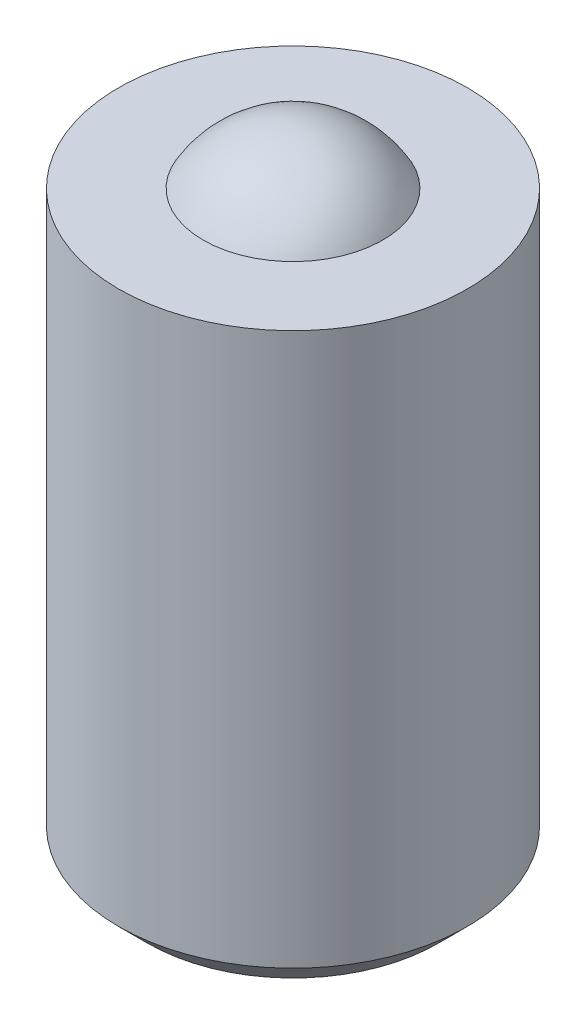
ISO-10303-21;
HEADER;
FILE_DESCRIPTION(('STEP AP214'),'2;1');
FILE_NAME('part.step','',(''),(''),'','','');
FILE_SCHEMA(('AUTOMOTIVE_DESIGN { 1 0 10303 214 1 1 1 1 }'));
ENDSEC;
DATA;
#1=APPLICATION_CONTEXT('core data for automotive mechanical design processes');
#2=APPLICATION_PROTOCOL_DEFINITION('international standard','automotive_design',2000,#1);
#3=PRODUCT_CONTEXT('',#1,'mechanical');
#4=PRODUCT('Part','Part','',(#3));
#5=PRODUCT_RELATED_PRODUCT_CATEGORY('part','',(#4));
#6=PRODUCT_DEFINITION_FORMATION('','',#4);
#7=PRODUCT_DEFINITION_CONTEXT('part definition',#1,'design');
#8=PRODUCT_DEFINITION('design','',#6,#7);
#9=PRODUCT_DEFINITION_SHAPE('','',#8);
#10=(LENGTH_UNIT() NAMED_UNIT(*) SI_UNIT(.MILLI.,.METRE.));
#11=(NAMED_UNIT(*) PLANE_ANGLE_UNIT() SI_UNIT($,.RADIAN.));
#12=(NAMED_UNIT(*) SI_UNIT($,.STERADIAN.) SOLID_ANGLE_UNIT());
#13=UNCERTAINTY_MEASURE_WITH_UNIT(LENGTH_MEASURE(1.E-05),#10,'distance_accuracy_value','');
#14=(GEOMETRIC_REPRESENTATION_CONTEXT(3) GLOBAL_UNCERTAINTY_ASSIGNED_CONTEXT((#13)) GLOBAL_UNIT_ASSIGNED_CONTEXT((#10,
#11,#12)) REPRESENTATION_CONTEXT('',''));
#15=CARTESIAN_POINT('',(0.,0.,0.));
#16=DIRECTION('',(0.,0.,1.));
#17=DIRECTION('',(1.,0.,0.));
#18=AXIS2_PLACEMENT_3D('',#15,#16,#17);
#19=CARTESIAN_POINT('',(0.,-1.75,0.));
#20=DIRECTION('',(0.,1.,0.));
#21=DIRECTION('',(0.,0.,1.));
#22=AXIS2_PLACEMENT_3D('',#19,#20,#21);
#23=SPHERICAL_SURFACE('',#22,3.55);
#24=CARTESIAN_POINT('',(0.,0.,0.));
#25=DIRECTION('',(0.,1.,0.));
#26=DIRECTION('',(0.,0.,1.));
#27=AXIS2_PLACEMENT_3D('',#24,#25,#26);
#28=CIRCLE('',#27,3.08868904229609);
#29=CARTESIAN_POINT('',(0.,0.,3.08868904229609));
#30=VERTEX_POINT('',#29);
#31=EDGE_CURVE('E11',#30,#30,#28,.T.);
#32=ORIENTED_EDGE('',*,*,#31,.T.);
#33=EDGE_LOOP('',(#32));
#34=FACE_BOUND('',#33,.T.);
#35=ADVANCED_FACE('F37',(#34),#23,.T.);
#36=CARTESIAN_POINT('',(0.,0.,3.08868904229609));
#37=DIRECTION('',(0.,1.,0.));
#38=DIRECTION('',(0.,0.,1.));
#39=AXIS2_PLACEMENT_3D('',#36,#37,#38);
#40=PLANE('',#39);
#41=CARTESIAN_POINT('',(0.,0.,0.));
#42=DIRECTION('',(0.,1.,0.));
#43=DIRECTION('',(0.,0.,1.));
#44=AXIS2_PLACEMENT_3D('',#41,#42,#43);
#45=CIRCLE('',#44,5.99999999999999);
#46=CARTESIAN_POINT('',(0.,0.,5.99999999999999));
#47=VERTEX_POINT('',#46);
#48=EDGE_CURVE('E44',#47,#47,#45,.T.);
#49=ORIENTED_EDGE('',*,*,#48,.T.);
#50=EDGE_LOOP('',(#49));
#51=FACE_BOUND('',#50,.T.);
#52=ORIENTED_EDGE('',*,*,#31,.F.);
#53=EDGE_LOOP('',(#52));
#54=FACE_BOUND('',#53,.T.);
#55=ADVANCED_FACE('F151',(#51,#54),#40,.T.);
#56=CARTESIAN_POINT('',(0.,46.2984024863754,0.));
#57=DIRECTION('',(0.,1.,0.));
#58=DIRECTION('',(0.,0.,1.));
#59=AXIS2_PLACEMENT_3D('',#56,#57,#58);
#60=CYLINDRICAL_SURFACE('',#59,5.99999999999999);
#61=CARTESIAN_POINT('',(0.,-19.,0.));
#62=DIRECTION('',(0.,1.,0.));
#63=DIRECTION('',(0.,0.,1.));
#64=AXIS2_PLACEMENT_3D('',#61,#62,#63);
#65=CIRCLE('',#64,5.99999999999999);
#66=CARTESIAN_POINT('',(0.,-19.,5.99999999999999));
#67=VERTEX_POINT('',#66);
#68=EDGE_CURVE('E146',#67,#67,#65,.T.);
#69=ORIENTED_EDGE('',*,*,#68,.T.);
#70=EDGE_LOOP('',(#69));
#71=FACE_BOUND('',#70,.T.);
#72=ORIENTED_EDGE('',*,*,#48,.F.);
#73=EDGE_LOOP('',(#72));
#74=FACE_BOUND('',#73,.T.);
#75=ADVANCED_FACE('F154',(#71,#74),#60,.T.);
#76=CARTESIAN_POINT('',(0.,-19.,0.));
#77=DIRECTION('',(0.,1.,0.));
#78=DIRECTION('',(0.,0.,1.));
#79=AXIS2_PLACEMENT_3D('',#76,#77,#78);
#80=CONICAL_SURFACE('',#79,5.99999999999999,0.785398163397444);
#81=CARTESIAN_POINT('',(0.,-20.,0.));
#82=DIRECTION('',(0.,1.,0.));
#83=DIRECTION('',(0.,0.,1.));
#84=AXIS2_PLACEMENT_3D('',#81,#82,#83);
#85=CIRCLE('',#84,5.);
#86=CARTESIAN_POINT('',(0.,-20.,5.));
#87=VERTEX_POINT('',#86);
#88=EDGE_CURVE('E138',#87,#87,#85,.T.);
#89=ORIENTED_EDGE('',*,*,#88,.T.);
#90=EDGE_LOOP('',(#89));
#91=FACE_BOUND('',#90,.T.);
#92=ORIENTED_EDGE('',*,*,#68,.F.);
#93=EDGE_LOOP('',(#92));
#94=FACE_BOUND('',#93,.T.);
#95=ADVANCED_FACE('F156',(#91,#94),#80,.T.);
#96=CARTESIAN_POINT('',(0.,-20.,5.));
#97=DIRECTION('',(0.,-1.,0.));
#98=DIRECTION('',(0.,0.,-1.));
#99=AXIS2_PLACEMENT_3D('',#96,#97,#98);
#100=PLANE('',#99);
#101=DIRECTION('',(-0.866025403784439,0.,0.5));
#102=VECTOR('',#101,1.);
#103=CARTESIAN_POINT('',(3.,-20.,1.73205080756888));
#104=LINE('',#103,#102);
#105=CARTESIAN_POINT('',(3.,-20.,1.73205080756888));
#106=VERTEX_POINT('',#105);
#107=CARTESIAN_POINT('',(0.,-20.,3.46410161513775));
#108=VERTEX_POINT('',#107);
#109=EDGE_CURVE('E51',#106,#108,#104,.T.);
#110=ORIENTED_EDGE('',*,*,#109,.F.);
#111=DIRECTION('',(0.,0.,1.));
#112=VECTOR('',#111,1.);
#113=CARTESIAN_POINT('',(3.,-20.,-1.73205080756888));
#114=LINE('',#113,#112);
#115=CARTESIAN_POINT('',(3.,-20.,-1.73205080756888));
#116=VERTEX_POINT('',#115);
#117=EDGE_CURVE('E134',#116,#106,#114,.T.);
#118=ORIENTED_EDGE('',*,*,#117,.F.);
#119=DIRECTION('',(0.866025403784439,0.,0.5));
#120=VECTOR('',#119,1.);
#121=CARTESIAN_POINT('',(0.,-20.,-3.46410161513775));
#122=LINE('',#121,#120);
#123=CARTESIAN_POINT('',(0.,-20.,-3.46410161513775));
#124=VERTEX_POINT('',#123);
#125=EDGE_CURVE('E132',#124,#116,#122,.T.);
#126=ORIENTED_EDGE('',*,*,#125,.F.);
#127=DIRECTION('',(0.866025403784439,0.,-0.5));
#128=VECTOR('',#127,1.);
#129=CARTESIAN_POINT('',(-3.,-20.,-1.73205080756888));
#130=LINE('',#129,#128);
#131=CARTESIAN_POINT('',(-3.,-20.,-1.73205080756888));
#132=VERTEX_POINT('',#131);
#133=EDGE_CURVE('E99',#132,#124,#130,.T.);
#134=ORIENTED_EDGE('',*,*,#133,.F.);
#135=DIRECTION('',(0.,0.,-1.));
#136=VECTOR('',#135,1.);
#137=CARTESIAN_POINT('',(-3.,-20.,1.73205080756888));
#138=LINE('',#137,#136);
#139=CARTESIAN_POINT('',(-3.,-20.,1.73205080756888));
#140=VERTEX_POINT('',#139);
#141=EDGE_CURVE('E128',#140,#132,#138,.T.);
#142=ORIENTED_EDGE('',*,*,#141,.F.);
#143=DIRECTION('',(-0.866025403784438,0.,-0.5));
#144=VECTOR('',#143,1.);
#145=CARTESIAN_POINT('',(0.,-20.,3.46410161513775));
#146=LINE('',#145,#144);
#147=EDGE_CURVE('E125',#108,#140,#146,.T.);
#148=ORIENTED_EDGE('',*,*,#147,.F.);
#149=EDGE_LOOP('',(#110,#118,#126,#134,#142,#148));
#150=FACE_BOUND('',#149,.T.);
#151=ORIENTED_EDGE('',*,*,#88,.F.);
#152=EDGE_LOOP('',(#151));
#153=FACE_BOUND('',#152,.T.);
#154=ADVANCED_FACE('F163',(#150,#153),#100,.T.);
#155=CARTESIAN_POINT('',(3.,-17.,1.73205080756888));
#156=DIRECTION('',(0.5,0.,0.866025403784439));
#157=DIRECTION('',(0.866025403784439,0.,-0.5));
#158=AXIS2_PLACEMENT_3D('',#155,#156,#157);
#159=PLANE('',#158);
#160=ORIENTED_EDGE('',*,*,#109,.T.);
#161=DIRECTION('',(0.,-1.,0.));
#162=VECTOR('',#161,1.);
#163=CARTESIAN_POINT('',(0.,-17.,3.46410161513775));
#164=LINE('',#163,#162);
#165=CARTESIAN_POINT('',(0.,-17.,3.46410161513775));
#166=VERTEX_POINT('',#165);
#167=EDGE_CURVE('E81',#166,#108,#164,.T.);
#168=ORIENTED_EDGE('',*,*,#167,.F.);
#169=DIRECTION('',(-0.866025403784439,0.,0.5));
#170=VECTOR('',#169,1.);
#171=CARTESIAN_POINT('',(3.,-17.,1.73205080756888));
#172=LINE('',#171,#170);
#173=CARTESIAN_POINT('',(3.,-17.,1.73205080756888));
#174=VERTEX_POINT('',#173);
#175=EDGE_CURVE('E136',#174,#166,#172,.T.);
#176=ORIENTED_EDGE('',*,*,#175,.F.);
#177=DIRECTION('',(0.,-1.,0.));
#178=VECTOR('',#177,1.);
#179=CARTESIAN_POINT('',(3.,-17.,1.73205080756888));
#180=LINE('',#179,#178);
#181=EDGE_CURVE('E59',#174,#106,#180,.T.);
#182=ORIENTED_EDGE('',*,*,#181,.T.);
#183=EDGE_LOOP('',(#160,#168,#176,#182));
#184=FACE_BOUND('',#183,.T.);
#185=ADVANCED_FACE('F194',(#184),#159,.F.);
#186=CARTESIAN_POINT('',(3.,-17.,-1.73205080756888));
#187=DIRECTION('',(1.,0.,0.));
#188=DIRECTION('',(0.,0.,-1.));
#189=AXIS2_PLACEMENT_3D('',#186,#187,#188);
#190=PLANE('',#189);
#191=ORIENTED_EDGE('',*,*,#117,.T.);
#192=ORIENTED_EDGE('',*,*,#181,.F.);
#193=DIRECTION('',(0.,0.,1.));
#194=VECTOR('',#193,1.);
#195=CARTESIAN_POINT('',(3.,-17.,-1.73205080756888));
#196=LINE('',#195,#194);
#197=CARTESIAN_POINT('',(3.,-17.,-1.73205080756888));
#198=VERTEX_POINT('',#197);
#199=EDGE_CURVE('E111',#198,#174,#196,.T.);
#200=ORIENTED_EDGE('',*,*,#199,.F.);
#201=DIRECTION('',(0.,-1.,0.));
#202=VECTOR('',#201,1.);
#203=CARTESIAN_POINT('',(3.,-17.,-1.73205080756888));
#204=LINE('',#203,#202);
#205=EDGE_CURVE('E103',#198,#116,#204,.T.);
#206=ORIENTED_EDGE('',*,*,#205,.T.);
#207=EDGE_LOOP('',(#191,#192,#200,#206));
#208=FACE_BOUND('',#207,.T.);
#209=ADVANCED_FACE('F204',(#208),#190,.F.);
#210=CARTESIAN_POINT('',(0.,-17.,-3.46410161513775));
#211=DIRECTION('',(0.5,0.,-0.866025403784438));
#212=DIRECTION('',(-0.866025403784439,0.,-0.5));
#213=AXIS2_PLACEMENT_3D('',#210,#211,#212);
#214=PLANE('',#213);
#215=ORIENTED_EDGE('',*,*,#125,.T.);
#216=ORIENTED_EDGE('',*,*,#205,.F.);
#217=DIRECTION('',(0.866025403784439,0.,0.5));
#218=VECTOR('',#217,1.);
#219=CARTESIAN_POINT('',(0.,-17.,-3.46410161513775));
#220=LINE('',#219,#218);
#221=CARTESIAN_POINT('',(0.,-17.,-3.46410161513775));
#222=VERTEX_POINT('',#221);
#223=EDGE_CURVE('E107',#222,#198,#220,.T.);
#224=ORIENTED_EDGE('',*,*,#223,.F.);
#225=DIRECTION('',(0.,-1.,0.));
#226=VECTOR('',#225,1.);
#227=CARTESIAN_POINT('',(0.,-17.,-3.46410161513775));
#228=LINE('',#227,#226);
#229=EDGE_CURVE('E92',#222,#124,#228,.T.);
#230=ORIENTED_EDGE('',*,*,#229,.T.);
#231=EDGE_LOOP('',(#215,#216,#224,#230));
#232=FACE_BOUND('',#231,.T.);
#233=ADVANCED_FACE('F108',(#232),#214,.F.);
#234=CARTESIAN_POINT('',(-3.,-17.,-1.73205080756888));
#235=DIRECTION('',(-0.5,0.,-0.866025403784439));
#236=DIRECTION('',(-0.866025403784439,0.,0.5));
#237=AXIS2_PLACEMENT_3D('',#234,#235,#236);
#238=PLANE('',#237);
#239=ORIENTED_EDGE('',*,*,#133,.T.);
#240=ORIENTED_EDGE('',*,*,#229,.F.);
#241=DIRECTION('',(0.866025403784439,0.,-0.5));
#242=VECTOR('',#241,1.);
#243=CARTESIAN_POINT('',(-3.,-17.,-1.73205080756888));
#244=LINE('',#243,#242);
#245=CARTESIAN_POINT('',(-3.,-17.,-1.73205080756888));
#246=VERTEX_POINT('',#245);
#247=EDGE_CURVE('E96',#246,#222,#244,.T.);
#248=ORIENTED_EDGE('',*,*,#247,.F.);
#249=DIRECTION('',(0.,-1.,0.));
#250=VECTOR('',#249,1.);
#251=CARTESIAN_POINT('',(-3.,-17.,-1.73205080756888));
#252=LINE('',#251,#250);
#253=EDGE_CURVE('E104',#246,#132,#252,.T.);
#254=ORIENTED_EDGE('',*,*,#253,.T.);
#255=EDGE_LOOP('',(#239,#240,#248,#254));
#256=FACE_BOUND('',#255,.T.);
#257=ADVANCED_FACE('F94',(#256),#238,.F.);
#258=CARTESIAN_POINT('',(-3.,-17.,1.73205080756888));
#259=DIRECTION('',(-1.,0.,0.));
#260=DIRECTION('',(0.,0.,1.));
#261=AXIS2_PLACEMENT_3D('',#258,#259,#260);
#262=PLANE('',#261);
#263=ORIENTED_EDGE('',*,*,#141,.T.);
#264=ORIENTED_EDGE('',*,*,#253,.F.);
#265=DIRECTION('',(0.,0.,-1.));
#266=VECTOR('',#265,1.);
#267=CARTESIAN_POINT('',(-3.,-17.,1.73205080756888));
#268=LINE('',#267,#266);
#269=CARTESIAN_POINT('',(-3.,-17.,1.73205080756888));
#270=VERTEX_POINT('',#269);
#271=EDGE_CURVE('E117',#270,#246,#268,.T.);
#272=ORIENTED_EDGE('',*,*,#271,.F.);
#273=DIRECTION('',(0.,-1.,0.));
#274=VECTOR('',#273,1.);
#275=CARTESIAN_POINT('',(-3.,-17.,1.73205080756888));
#276=LINE('',#275,#274);
#277=EDGE_CURVE('E141',#270,#140,#276,.T.);
#278=ORIENTED_EDGE('',*,*,#277,.T.);
#279=EDGE_LOOP('',(#263,#264,#272,#278));
#280=FACE_BOUND('',#279,.T.);
#281=ADVANCED_FACE('F229',(#280),#262,.F.);
#282=CARTESIAN_POINT('',(0.,-17.,3.46410161513775));
#283=DIRECTION('',(-0.5,0.,0.866025403784439));
#284=DIRECTION('',(0.866025403784439,0.,0.5));
#285=AXIS2_PLACEMENT_3D('',#282,#283,#284);
#286=PLANE('',#285);
#287=ORIENTED_EDGE('',*,*,#147,.T.);
#288=ORIENTED_EDGE('',*,*,#277,.F.);
#289=DIRECTION('',(-0.866025403784438,0.,-0.5));
#290=VECTOR('',#289,1.);
#291=CARTESIAN_POINT('',(0.,-17.,3.46410161513775));
#292=LINE('',#291,#290);
#293=EDGE_CURVE('E119',#166,#270,#292,.T.);
#294=ORIENTED_EDGE('',*,*,#293,.F.);
#295=ORIENTED_EDGE('',*,*,#167,.T.);
#296=EDGE_LOOP('',(#287,#288,#294,#295));
#297=FACE_BOUND('',#296,.T.);
#298=ADVANCED_FACE('F238',(#297),#286,.F.);
#299=CARTESIAN_POINT('',(0.,-17.,0.));
#300=DIRECTION('',(0.,-1.,0.));
#301=DIRECTION('',(0.,0.,-1.));
#302=AXIS2_PLACEMENT_3D('',#299,#300,#301);
#303=PLANE('',#302);
#304=ORIENTED_EDGE('',*,*,#175,.T.);
#305=ORIENTED_EDGE('',*,*,#293,.T.);
#306=ORIENTED_EDGE('',*,*,#271,.T.);
#307=ORIENTED_EDGE('',*,*,#247,.T.);
#308=ORIENTED_EDGE('',*,*,#223,.T.);
#309=ORIENTED_EDGE('',*,*,#199,.T.);
#310=EDGE_LOOP('',(#304,#305,#306,#307,#308,#309));
#311=FACE_BOUND('',#310,.T.);
#312=ADVANCED_FACE('F114',(#311),#303,.T.);
#313=CLOSED_SHELL('',(#35,#55,#75,#95,#154,#185,#209,#233,#257,#281,#298,#312));
#314=MANIFOLD_SOLID_BREP('B2',#313);
#315=ADVANCED_BREP_SHAPE_REPRESENTATION('',(#18,#314),#14);
#316=SHAPE_DEFINITION_REPRESENTATION(#9,#315);
ENDSEC;
END-ISO-10303-21;
